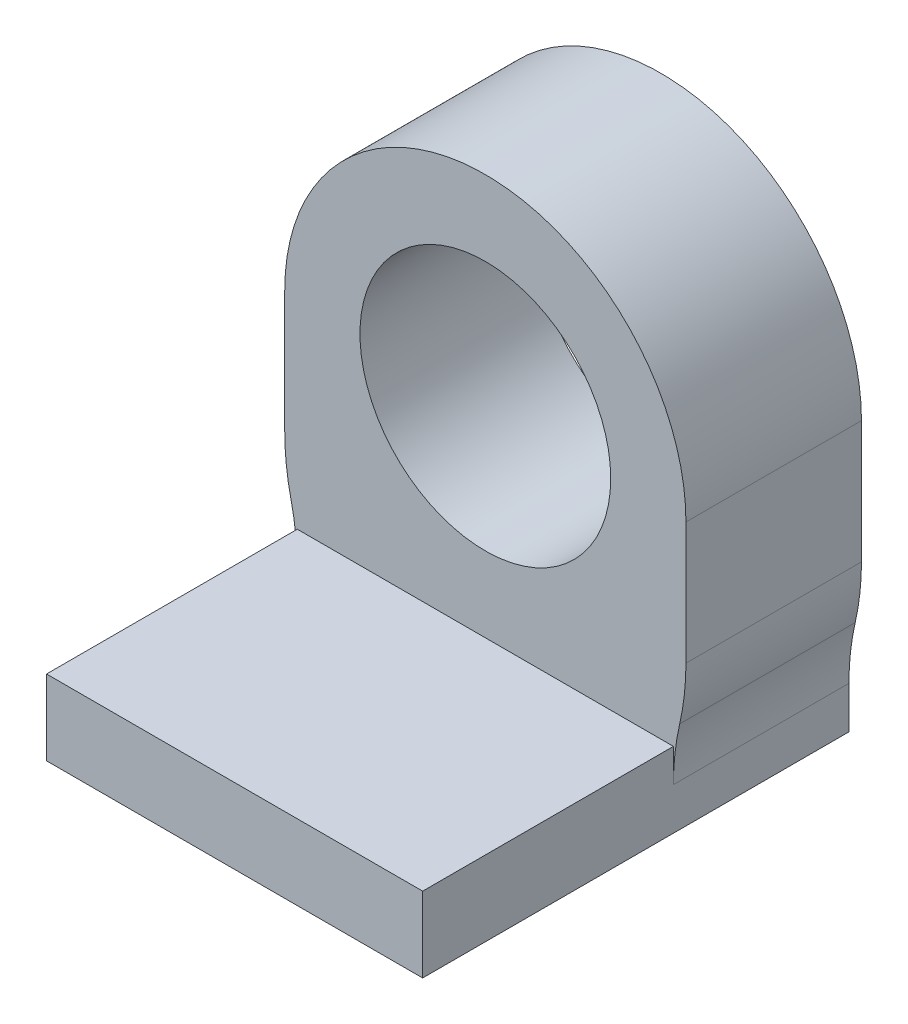
ISO-10303-21;
HEADER;
FILE_DESCRIPTION(('STEP AP214'),'2;1');
FILE_NAME('part.step','',(''),(''),'','','');
FILE_SCHEMA(('AUTOMOTIVE_DESIGN { 1 0 10303 214 1 1 1 1 }'));
ENDSEC;
DATA;
#1=APPLICATION_CONTEXT('core data for automotive mechanical design processes');
#2=APPLICATION_PROTOCOL_DEFINITION('international standard','automotive_design',2000,#1);
#3=PRODUCT_CONTEXT('',#1,'mechanical');
#4=PRODUCT('Part','Part','',(#3));
#5=PRODUCT_RELATED_PRODUCT_CATEGORY('part','',(#4));
#6=PRODUCT_DEFINITION_FORMATION('','',#4);
#7=PRODUCT_DEFINITION_CONTEXT('part definition',#1,'design');
#8=PRODUCT_DEFINITION('design','',#6,#7);
#9=PRODUCT_DEFINITION_SHAPE('','',#8);
#10=(LENGTH_UNIT() NAMED_UNIT(*) SI_UNIT(.MILLI.,.METRE.));
#11=(NAMED_UNIT(*) PLANE_ANGLE_UNIT() SI_UNIT($,.RADIAN.));
#12=(NAMED_UNIT(*) SI_UNIT($,.STERADIAN.) SOLID_ANGLE_UNIT());
#13=UNCERTAINTY_MEASURE_WITH_UNIT(LENGTH_MEASURE(1.E-05),#10,'distance_accuracy_value','');
#14=(GEOMETRIC_REPRESENTATION_CONTEXT(3) GLOBAL_UNCERTAINTY_ASSIGNED_CONTEXT((#13)) GLOBAL_UNIT_ASSIGNED_CONTEXT((#10,
#11,#12)) REPRESENTATION_CONTEXT('',''));
#15=CARTESIAN_POINT('',(0.,0.,0.));
#16=DIRECTION('',(0.,0.,1.));
#17=DIRECTION('',(1.,0.,0.));
#18=AXIS2_PLACEMENT_3D('',#15,#16,#17);
#19=CARTESIAN_POINT('',(0.,0.,7.));
#20=DIRECTION('',(0.,0.,1.));
#21=DIRECTION('',(1.,0.,0.));
#22=AXIS2_PLACEMENT_3D('',#19,#20,#21);
#23=PLANE('',#22);
#24=DIRECTION('',(0.,-1.,0.));
#25=VECTOR('',#24,1.);
#26=CARTESIAN_POINT('',(-8.,0.,7.));
#27=LINE('',#26,#25);
#28=CARTESIAN_POINT('',(-8.,0.,7.));
#29=VERTEX_POINT('',#28);
#30=CARTESIAN_POINT('',(-8.,-4.8775010008008,7.));
#31=VERTEX_POINT('',#30);
#32=EDGE_CURVE('E171',#29,#31,#27,.T.);
#33=ORIENTED_EDGE('',*,*,#32,.T.);
#34=CARTESIAN_POINT('',(2.,-4.8775010008008,7.));
#35=DIRECTION('',(0.,0.,1.));
#36=DIRECTION('',(1.,0.,0.));
#37=AXIS2_PLACEMENT_3D('',#34,#35,#36);
#38=CIRCLE('',#37,10.);
#39=CARTESIAN_POINT('',(-7.75,-7.09954960512969,7.));
#40=VERTEX_POINT('',#39);
#41=EDGE_CURVE('E204',#31,#40,#38,.T.);
#42=ORIENTED_EDGE('',*,*,#41,.T.);
#43=CARTESIAN_POINT('',(-17.5,-9.32159820945859,7.));
#44=DIRECTION('',(0.,0.,1.));
#45=DIRECTION('',(1.,0.,0.));
#46=AXIS2_PLACEMENT_3D('',#43,#44,#45);
#47=CIRCLE('',#46,10.);
#48=CARTESIAN_POINT('',(-7.5,-9.32159820945859,7.));
#49=VERTEX_POINT('',#48);
#50=EDGE_CURVE('E11',#40,#49,#47,.F.);
#51=ORIENTED_EDGE('',*,*,#50,.T.);
#52=DIRECTION('',(0.,-1.,0.));
#53=VECTOR('',#52,1.);
#54=CARTESIAN_POINT('',(-7.5,-8.,7.));
#55=LINE('',#54,#53);
#56=CARTESIAN_POINT('',(-7.5,-8.,7.));
#57=VERTEX_POINT('',#56);
#58=EDGE_CURVE('E51',#57,#49,#55,.T.);
#59=ORIENTED_EDGE('',*,*,#58,.F.);
#60=DIRECTION('',(-1.,0.,0.));
#61=VECTOR('',#60,1.);
#62=CARTESIAN_POINT('',(-7.5,-8.,7.));
#63=LINE('',#62,#61);
#64=CARTESIAN_POINT('',(7.5,-8.,7.));
#65=VERTEX_POINT('',#64);
#66=EDGE_CURVE('E149',#65,#57,#63,.T.);
#67=ORIENTED_EDGE('',*,*,#66,.F.);
#68=DIRECTION('',(0.,1.,0.));
#69=VECTOR('',#68,1.);
#70=CARTESIAN_POINT('',(7.5,-11.,7.));
#71=LINE('',#70,#69);
#72=CARTESIAN_POINT('',(7.5,-9.32159820945861,7.));
#73=VERTEX_POINT('',#72);
#74=EDGE_CURVE('E213',#73,#65,#71,.T.);
#75=ORIENTED_EDGE('',*,*,#74,.F.);
#76=CARTESIAN_POINT('',(17.5,-9.3215982094586,7.));
#77=DIRECTION('',(0.,0.,1.));
#78=DIRECTION('',(1.,0.,0.));
#79=AXIS2_PLACEMENT_3D('',#76,#77,#78);
#80=CIRCLE('',#79,10.);
#81=CARTESIAN_POINT('',(7.75,-7.0995496051297,7.));
#82=VERTEX_POINT('',#81);
#83=EDGE_CURVE('E225',#73,#82,#80,.F.);
#84=ORIENTED_EDGE('',*,*,#83,.T.);
#85=CARTESIAN_POINT('',(-2.,-4.8775010008008,7.));
#86=DIRECTION('',(0.,0.,1.));
#87=DIRECTION('',(1.,0.,0.));
#88=AXIS2_PLACEMENT_3D('',#85,#86,#87);
#89=CIRCLE('',#88,10.);
#90=CARTESIAN_POINT('',(8.,-4.8775010008008,7.));
#91=VERTEX_POINT('',#90);
#92=EDGE_CURVE('E202',#82,#91,#89,.T.);
#93=ORIENTED_EDGE('',*,*,#92,.T.);
#94=DIRECTION('',(0.,1.,0.));
#95=VECTOR('',#94,1.);
#96=CARTESIAN_POINT('',(8.,-8.,7.));
#97=LINE('',#96,#95);
#98=CARTESIAN_POINT('',(8.,0.,7.));
#99=VERTEX_POINT('',#98);
#100=EDGE_CURVE('E175',#91,#99,#97,.T.);
#101=ORIENTED_EDGE('',*,*,#100,.T.);
#102=CARTESIAN_POINT('',(0.,0.,7.));
#103=DIRECTION('',(0.,0.,1.));
#104=DIRECTION('',(1.,0.,0.));
#105=AXIS2_PLACEMENT_3D('',#102,#103,#104);
#106=CIRCLE('',#105,8.);
#107=EDGE_CURVE('E168',#99,#29,#106,.T.);
#108=ORIENTED_EDGE('',*,*,#107,.T.);
#109=EDGE_LOOP('',(#33,#42,#51,#59,#67,#75,#84,#93,#101,#108));
#110=FACE_BOUND('',#109,.T.);
#111=CARTESIAN_POINT('',(0.,0.,7.));
#112=DIRECTION('',(0.,0.,1.));
#113=DIRECTION('',(1.,0.,0.));
#114=AXIS2_PLACEMENT_3D('',#111,#112,#113);
#115=CIRCLE('',#114,5.);
#116=CARTESIAN_POINT('',(5.,0.,7.));
#117=VERTEX_POINT('',#116);
#118=EDGE_CURVE('E162',#117,#117,#115,.T.);
#119=ORIENTED_EDGE('',*,*,#118,.F.);
#120=EDGE_LOOP('',(#119));
#121=FACE_BOUND('',#120,.T.);
#122=ADVANCED_FACE('F37',(#110,#121),#23,.T.);
#123=CARTESIAN_POINT('',(0.,0.,0.));
#124=DIRECTION('',(0.,0.,1.));
#125=DIRECTION('',(1.,0.,0.));
#126=AXIS2_PLACEMENT_3D('',#123,#124,#125);
#127=PLANE('',#126);
#128=DIRECTION('',(0.,-1.,0.));
#129=VECTOR('',#128,1.);
#130=CARTESIAN_POINT('',(-7.5,-8.,0.));
#131=LINE('',#130,#129);
#132=CARTESIAN_POINT('',(-7.5,-9.32159820945859,0.));
#133=VERTEX_POINT('',#132);
#134=CARTESIAN_POINT('',(-7.5,-11.,0.));
#135=VERTEX_POINT('',#134);
#136=EDGE_CURVE('E131',#133,#135,#131,.T.);
#137=ORIENTED_EDGE('',*,*,#136,.F.);
#138=CARTESIAN_POINT('',(-17.5,-9.32159820945859,0.));
#139=DIRECTION('',(0.,0.,1.));
#140=DIRECTION('',(1.,0.,0.));
#141=AXIS2_PLACEMENT_3D('',#138,#139,#140);
#142=CIRCLE('',#141,10.);
#143=CARTESIAN_POINT('',(-7.75,-7.09954960512969,0.));
#144=VERTEX_POINT('',#143);
#145=EDGE_CURVE('E45',#133,#144,#142,.T.);
#146=ORIENTED_EDGE('',*,*,#145,.T.);
#147=CARTESIAN_POINT('',(2.,-4.8775010008008,0.));
#148=DIRECTION('',(0.,0.,1.));
#149=DIRECTION('',(1.,0.,0.));
#150=AXIS2_PLACEMENT_3D('',#147,#148,#149);
#151=CIRCLE('',#150,10.);
#152=CARTESIAN_POINT('',(-8.,-4.8775010008008,0.));
#153=VERTEX_POINT('',#152);
#154=EDGE_CURVE('E198',#144,#153,#151,.F.);
#155=ORIENTED_EDGE('',*,*,#154,.T.);
#156=DIRECTION('',(0.,-1.,0.));
#157=VECTOR('',#156,1.);
#158=CARTESIAN_POINT('',(-8.,0.,0.));
#159=LINE('',#158,#157);
#160=CARTESIAN_POINT('',(-8.,0.,0.));
#161=VERTEX_POINT('',#160);
#162=EDGE_CURVE('E180',#161,#153,#159,.T.);
#163=ORIENTED_EDGE('',*,*,#162,.F.);
#164=CARTESIAN_POINT('',(0.,0.,0.));
#165=DIRECTION('',(0.,0.,1.));
#166=DIRECTION('',(1.,0.,0.));
#167=AXIS2_PLACEMENT_3D('',#164,#165,#166);
#168=CIRCLE('',#167,8.);
#169=CARTESIAN_POINT('',(8.,0.,0.));
#170=VERTEX_POINT('',#169);
#171=EDGE_CURVE('E165',#170,#161,#168,.T.);
#172=ORIENTED_EDGE('',*,*,#171,.F.);
#173=DIRECTION('',(0.,1.,0.));
#174=VECTOR('',#173,1.);
#175=CARTESIAN_POINT('',(8.,-8.,0.));
#176=LINE('',#175,#174);
#177=CARTESIAN_POINT('',(8.,-4.8775010008008,0.));
#178=VERTEX_POINT('',#177);
#179=EDGE_CURVE('E172',#178,#170,#176,.T.);
#180=ORIENTED_EDGE('',*,*,#179,.F.);
#181=CARTESIAN_POINT('',(-2.,-4.8775010008008,0.));
#182=DIRECTION('',(0.,0.,1.));
#183=DIRECTION('',(1.,0.,0.));
#184=AXIS2_PLACEMENT_3D('',#181,#182,#183);
#185=CIRCLE('',#184,10.);
#186=CARTESIAN_POINT('',(7.75,-7.0995496051297,0.));
#187=VERTEX_POINT('',#186);
#188=EDGE_CURVE('E195',#178,#187,#185,.F.);
#189=ORIENTED_EDGE('',*,*,#188,.T.);
#190=CARTESIAN_POINT('',(17.5,-9.3215982094586,0.));
#191=DIRECTION('',(0.,0.,1.));
#192=DIRECTION('',(1.,0.,0.));
#193=AXIS2_PLACEMENT_3D('',#190,#191,#192);
#194=CIRCLE('',#193,10.);
#195=CARTESIAN_POINT('',(7.5,-9.32159820945861,0.));
#196=VERTEX_POINT('',#195);
#197=EDGE_CURVE('E223',#187,#196,#194,.T.);
#198=ORIENTED_EDGE('',*,*,#197,.T.);
#199=DIRECTION('',(0.,1.,0.));
#200=VECTOR('',#199,1.);
#201=CARTESIAN_POINT('',(7.5,-11.,0.));
#202=LINE('',#201,#200);
#203=CARTESIAN_POINT('',(7.5,-11.,0.));
#204=VERTEX_POINT('',#203);
#205=EDGE_CURVE('E186',#204,#196,#202,.T.);
#206=ORIENTED_EDGE('',*,*,#205,.F.);
#207=DIRECTION('',(1.,0.,0.));
#208=VECTOR('',#207,1.);
#209=CARTESIAN_POINT('',(-7.5,-11.,0.));
#210=LINE('',#209,#208);
#211=EDGE_CURVE('E184',#135,#204,#210,.T.);
#212=ORIENTED_EDGE('',*,*,#211,.F.);
#213=EDGE_LOOP('',(#137,#146,#155,#163,#172,#180,#189,#198,#206,#212));
#214=FACE_BOUND('',#213,.T.);
#215=CARTESIAN_POINT('',(0.,0.,0.));
#216=DIRECTION('',(0.,0.,1.));
#217=DIRECTION('',(1.,0.,0.));
#218=AXIS2_PLACEMENT_3D('',#215,#216,#217);
#219=CIRCLE('',#218,5.);
#220=CARTESIAN_POINT('',(5.,0.,0.));
#221=VERTEX_POINT('',#220);
#222=EDGE_CURVE('E161',#221,#221,#219,.T.);
#223=ORIENTED_EDGE('',*,*,#222,.T.);
#224=EDGE_LOOP('',(#223));
#225=FACE_BOUND('',#224,.T.);
#226=ADVANCED_FACE('F238',(#214,#225),#127,.F.);
#227=CARTESIAN_POINT('',(0.,0.,7.));
#228=DIRECTION('',(0.,0.,-1.));
#229=DIRECTION('',(-1.,0.,0.));
#230=AXIS2_PLACEMENT_3D('',#227,#228,#229);
#231=CYLINDRICAL_SURFACE('',#230,8.);
#232=ORIENTED_EDGE('',*,*,#171,.T.);
#233=DIRECTION('',(0.,0.,-1.));
#234=VECTOR('',#233,1.);
#235=CARTESIAN_POINT('',(-8.,0.,7.));
#236=LINE('',#235,#234);
#237=EDGE_CURVE('E134',#29,#161,#236,.T.);
#238=ORIENTED_EDGE('',*,*,#237,.F.);
#239=ORIENTED_EDGE('',*,*,#107,.F.);
#240=DIRECTION('',(0.,0.,-1.));
#241=VECTOR('',#240,1.);
#242=CARTESIAN_POINT('',(8.,0.,7.));
#243=LINE('',#242,#241);
#244=EDGE_CURVE('E177',#99,#170,#243,.T.);
#245=ORIENTED_EDGE('',*,*,#244,.T.);
#246=EDGE_LOOP('',(#232,#238,#239,#245));
#247=FACE_BOUND('',#246,.T.);
#248=ADVANCED_FACE('F260',(#247),#231,.T.);
#249=CARTESIAN_POINT('',(-8.,0.,7.));
#250=DIRECTION('',(1.,0.,0.));
#251=DIRECTION('',(0.,1.,0.));
#252=AXIS2_PLACEMENT_3D('',#249,#250,#251);
#253=PLANE('',#252);
#254=ORIENTED_EDGE('',*,*,#162,.T.);
#255=DIRECTION('',(0.,0.,-1.));
#256=VECTOR('',#255,1.);
#257=CARTESIAN_POINT('',(-8.,-4.8775010008008,7.));
#258=LINE('',#257,#256);
#259=EDGE_CURVE('E200',#153,#31,#258,.F.);
#260=ORIENTED_EDGE('',*,*,#259,.T.);
#261=ORIENTED_EDGE('',*,*,#32,.F.);
#262=ORIENTED_EDGE('',*,*,#237,.T.);
#263=EDGE_LOOP('',(#254,#260,#261,#262));
#264=FACE_BOUND('',#263,.T.);
#265=ADVANCED_FACE('F257',(#264),#253,.F.);
#266=CARTESIAN_POINT('',(-7.5,-8.,7.));
#267=DIRECTION('',(1.,0.,0.));
#268=DIRECTION('',(0.,1.,0.));
#269=AXIS2_PLACEMENT_3D('',#266,#267,#268);
#270=PLANE('',#269);
#271=ORIENTED_EDGE('',*,*,#58,.T.);
#272=DIRECTION('',(0.,0.,-1.));
#273=VECTOR('',#272,1.);
#274=CARTESIAN_POINT('',(-7.5,-9.32159820945859,7.));
#275=LINE('',#274,#273);
#276=EDGE_CURVE('E219',#49,#133,#275,.T.);
#277=ORIENTED_EDGE('',*,*,#276,.T.);
#278=ORIENTED_EDGE('',*,*,#136,.T.);
#279=DIRECTION('',(0.,0.,-1.));
#280=VECTOR('',#279,1.);
#281=CARTESIAN_POINT('',(-7.5,-11.,7.));
#282=LINE('',#281,#280);
#283=CARTESIAN_POINT('',(-7.5,-11.,17.));
#284=VERTEX_POINT('',#283);
#285=EDGE_CURVE('E125',#284,#135,#282,.T.);
#286=ORIENTED_EDGE('',*,*,#285,.F.);
#287=DIRECTION('',(0.,-1.,0.));
#288=VECTOR('',#287,1.);
#289=CARTESIAN_POINT('',(-7.5,-11.,17.));
#290=LINE('',#289,#288);
#291=CARTESIAN_POINT('',(-7.5,-8.,17.));
#292=VERTEX_POINT('',#291);
#293=EDGE_CURVE('E129',#292,#284,#290,.T.);
#294=ORIENTED_EDGE('',*,*,#293,.F.);
#295=DIRECTION('',(0.,0.,-1.));
#296=VECTOR('',#295,1.);
#297=CARTESIAN_POINT('',(-7.5,-8.,17.));
#298=LINE('',#297,#296);
#299=EDGE_CURVE('E155',#292,#57,#298,.T.);
#300=ORIENTED_EDGE('',*,*,#299,.T.);
#301=EDGE_LOOP('',(#271,#277,#278,#286,#294,#300));
#302=FACE_BOUND('',#301,.T.);
#303=ADVANCED_FACE('F127',(#302),#270,.F.);
#304=CARTESIAN_POINT('',(-7.5,-11.,7.));
#305=DIRECTION('',(0.,1.,0.));
#306=DIRECTION('',(-1.,0.,0.));
#307=AXIS2_PLACEMENT_3D('',#304,#305,#306);
#308=PLANE('',#307);
#309=ORIENTED_EDGE('',*,*,#211,.T.);
#310=DIRECTION('',(0.,0.,-1.));
#311=VECTOR('',#310,1.);
#312=CARTESIAN_POINT('',(7.5,-11.,7.));
#313=LINE('',#312,#311);
#314=CARTESIAN_POINT('',(7.5,-11.,17.));
#315=VERTEX_POINT('',#314);
#316=EDGE_CURVE('E135',#315,#204,#313,.T.);
#317=ORIENTED_EDGE('',*,*,#316,.F.);
#318=DIRECTION('',(1.,0.,0.));
#319=VECTOR('',#318,1.);
#320=CARTESIAN_POINT('',(-7.5,-11.,17.));
#321=LINE('',#320,#319);
#322=EDGE_CURVE('E138',#284,#315,#321,.T.);
#323=ORIENTED_EDGE('',*,*,#322,.F.);
#324=ORIENTED_EDGE('',*,*,#285,.T.);
#325=EDGE_LOOP('',(#309,#317,#323,#324));
#326=FACE_BOUND('',#325,.T.);
#327=ADVANCED_FACE('F139',(#326),#308,.F.);
#328=CARTESIAN_POINT('',(7.5,-11.,7.));
#329=DIRECTION('',(-1.,0.,0.));
#330=DIRECTION('',(0.,-1.,0.));
#331=AXIS2_PLACEMENT_3D('',#328,#329,#330);
#332=PLANE('',#331);
#333=ORIENTED_EDGE('',*,*,#205,.T.);
#334=DIRECTION('',(0.,0.,1.));
#335=VECTOR('',#334,1.);
#336=CARTESIAN_POINT('',(7.5,-9.32159820945861,7.));
#337=LINE('',#336,#335);
#338=EDGE_CURVE('E215',#196,#73,#337,.T.);
#339=ORIENTED_EDGE('',*,*,#338,.T.);
#340=ORIENTED_EDGE('',*,*,#74,.T.);
#341=DIRECTION('',(0.,0.,-1.));
#342=VECTOR('',#341,1.);
#343=CARTESIAN_POINT('',(7.5,-8.,17.));
#344=LINE('',#343,#342);
#345=CARTESIAN_POINT('',(7.5,-8.,17.));
#346=VERTEX_POINT('',#345);
#347=EDGE_CURVE('E158',#346,#65,#344,.T.);
#348=ORIENTED_EDGE('',*,*,#347,.F.);
#349=DIRECTION('',(0.,1.,0.));
#350=VECTOR('',#349,1.);
#351=CARTESIAN_POINT('',(7.5,-11.,17.));
#352=LINE('',#351,#350);
#353=EDGE_CURVE('E143',#315,#346,#352,.T.);
#354=ORIENTED_EDGE('',*,*,#353,.F.);
#355=ORIENTED_EDGE('',*,*,#316,.T.);
#356=EDGE_LOOP('',(#333,#339,#340,#348,#354,#355));
#357=FACE_BOUND('',#356,.T.);
#358=ADVANCED_FACE('F242',(#357),#332,.F.);
#359=CARTESIAN_POINT('',(8.,-8.,7.));
#360=DIRECTION('',(-1.,0.,0.));
#361=DIRECTION('',(0.,-1.,0.));
#362=AXIS2_PLACEMENT_3D('',#359,#360,#361);
#363=PLANE('',#362);
#364=ORIENTED_EDGE('',*,*,#100,.F.);
#365=DIRECTION('',(0.,0.,1.));
#366=VECTOR('',#365,1.);
#367=CARTESIAN_POINT('',(8.,-4.8775010008008,7.));
#368=LINE('',#367,#366);
#369=EDGE_CURVE('E207',#91,#178,#368,.F.);
#370=ORIENTED_EDGE('',*,*,#369,.T.);
#371=ORIENTED_EDGE('',*,*,#179,.T.);
#372=ORIENTED_EDGE('',*,*,#244,.F.);
#373=EDGE_LOOP('',(#364,#370,#371,#372));
#374=FACE_BOUND('',#373,.T.);
#375=ADVANCED_FACE('F263',(#374),#363,.F.);
#376=CARTESIAN_POINT('',(0.,0.,7.));
#377=DIRECTION('',(0.,0.,-1.));
#378=DIRECTION('',(-1.,0.,0.));
#379=AXIS2_PLACEMENT_3D('',#376,#377,#378);
#380=CYLINDRICAL_SURFACE('',#379,5.);
#381=ORIENTED_EDGE('',*,*,#118,.T.);
#382=EDGE_LOOP('',(#381));
#383=FACE_BOUND('',#382,.T.);
#384=ORIENTED_EDGE('',*,*,#222,.F.);
#385=EDGE_LOOP('',(#384));
#386=FACE_BOUND('',#385,.T.);
#387=ADVANCED_FACE('F265',(#383,#386),#380,.F.);
#388=CARTESIAN_POINT('',(-7.5,-8.,17.));
#389=DIRECTION('',(0.,-1.,0.));
#390=DIRECTION('',(0.,0.,-1.));
#391=AXIS2_PLACEMENT_3D('',#388,#389,#390);
#392=PLANE('',#391);
#393=ORIENTED_EDGE('',*,*,#66,.T.);
#394=ORIENTED_EDGE('',*,*,#299,.F.);
#395=DIRECTION('',(-1.,0.,0.));
#396=VECTOR('',#395,1.);
#397=CARTESIAN_POINT('',(-7.5,-8.,17.));
#398=LINE('',#397,#396);
#399=EDGE_CURVE('E147',#346,#292,#398,.T.);
#400=ORIENTED_EDGE('',*,*,#399,.F.);
#401=ORIENTED_EDGE('',*,*,#347,.T.);
#402=EDGE_LOOP('',(#393,#394,#400,#401));
#403=FACE_BOUND('',#402,.T.);
#404=ADVANCED_FACE('F245',(#403),#392,.F.);
#405=CARTESIAN_POINT('',(0.,0.,17.));
#406=DIRECTION('',(0.,0.,-1.));
#407=DIRECTION('',(-1.,0.,0.));
#408=AXIS2_PLACEMENT_3D('',#405,#406,#407);
#409=PLANE('',#408);
#410=ORIENTED_EDGE('',*,*,#293,.T.);
#411=ORIENTED_EDGE('',*,*,#322,.T.);
#412=ORIENTED_EDGE('',*,*,#353,.T.);
#413=ORIENTED_EDGE('',*,*,#399,.T.);
#414=EDGE_LOOP('',(#410,#411,#412,#413));
#415=FACE_BOUND('',#414,.T.);
#416=ADVANCED_FACE('F145',(#415),#409,.F.);
#417=CARTESIAN_POINT('',(2.,-4.8775010008008,7.));
#418=DIRECTION('',(0.,0.,-1.));
#419=DIRECTION('',(-1.,0.,0.));
#420=AXIS2_PLACEMENT_3D('',#417,#418,#419);
#421=CYLINDRICAL_SURFACE('',#420,10.);
#422=ORIENTED_EDGE('',*,*,#154,.F.);
#423=DIRECTION('',(0.,0.,-1.));
#424=VECTOR('',#423,1.);
#425=CARTESIAN_POINT('',(-7.75,-7.09954960512969,7.));
#426=LINE('',#425,#424);
#427=EDGE_CURVE('E221',#144,#40,#426,.F.);
#428=ORIENTED_EDGE('',*,*,#427,.T.);
#429=ORIENTED_EDGE('',*,*,#41,.F.);
#430=ORIENTED_EDGE('',*,*,#259,.F.);
#431=EDGE_LOOP('',(#422,#428,#429,#430));
#432=FACE_BOUND('',#431,.T.);
#433=ADVANCED_FACE('F252',(#432),#421,.T.);
#434=CARTESIAN_POINT('',(-2.,-4.8775010008008,7.));
#435=DIRECTION('',(0.,0.,1.));
#436=DIRECTION('',(1.,0.,0.));
#437=AXIS2_PLACEMENT_3D('',#434,#435,#436);
#438=CYLINDRICAL_SURFACE('',#437,10.);
#439=ORIENTED_EDGE('',*,*,#92,.F.);
#440=DIRECTION('',(0.,0.,1.));
#441=VECTOR('',#440,1.);
#442=CARTESIAN_POINT('',(7.75,-7.0995496051297,7.));
#443=LINE('',#442,#441);
#444=EDGE_CURVE('E210',#82,#187,#443,.F.);
#445=ORIENTED_EDGE('',*,*,#444,.T.);
#446=ORIENTED_EDGE('',*,*,#188,.F.);
#447=ORIENTED_EDGE('',*,*,#369,.F.);
#448=EDGE_LOOP('',(#439,#445,#446,#447));
#449=FACE_BOUND('',#448,.T.);
#450=ADVANCED_FACE('F235',(#449),#438,.T.);
#451=CARTESIAN_POINT('',(17.5,-9.3215982094586,7.));
#452=DIRECTION('',(0.,0.,1.));
#453=DIRECTION('',(1.,0.,0.));
#454=AXIS2_PLACEMENT_3D('',#451,#452,#453);
#455=CYLINDRICAL_SURFACE('',#454,10.);
#456=ORIENTED_EDGE('',*,*,#83,.F.);
#457=ORIENTED_EDGE('',*,*,#338,.F.);
#458=ORIENTED_EDGE('',*,*,#197,.F.);
#459=ORIENTED_EDGE('',*,*,#444,.F.);
#460=EDGE_LOOP('',(#456,#457,#458,#459));
#461=FACE_BOUND('',#460,.T.);
#462=ADVANCED_FACE('F236',(#461),#455,.F.);
#463=CARTESIAN_POINT('',(-17.5,-9.32159820945859,7.));
#464=DIRECTION('',(0.,0.,-1.));
#465=DIRECTION('',(-1.,0.,0.));
#466=AXIS2_PLACEMENT_3D('',#463,#464,#465);
#467=CYLINDRICAL_SURFACE('',#466,10.);
#468=ORIENTED_EDGE('',*,*,#50,.F.);
#469=ORIENTED_EDGE('',*,*,#427,.F.);
#470=ORIENTED_EDGE('',*,*,#145,.F.);
#471=ORIENTED_EDGE('',*,*,#276,.F.);
#472=EDGE_LOOP('',(#468,#469,#470,#471));
#473=FACE_BOUND('',#472,.T.);
#474=ADVANCED_FACE('F39',(#473),#467,.F.);
#475=CLOSED_SHELL('',(#122,#226,#248,#265,#303,#327,#358,#375,#387,#404,#416,#433,#450,#462,#474));
#476=MANIFOLD_SOLID_BREP('B2',#475);
#477=ADVANCED_BREP_SHAPE_REPRESENTATION('',(#18,#476),#14);
#478=SHAPE_DEFINITION_REPRESENTATION(#9,#477);
ENDSEC;
END-ISO-10303-21;
